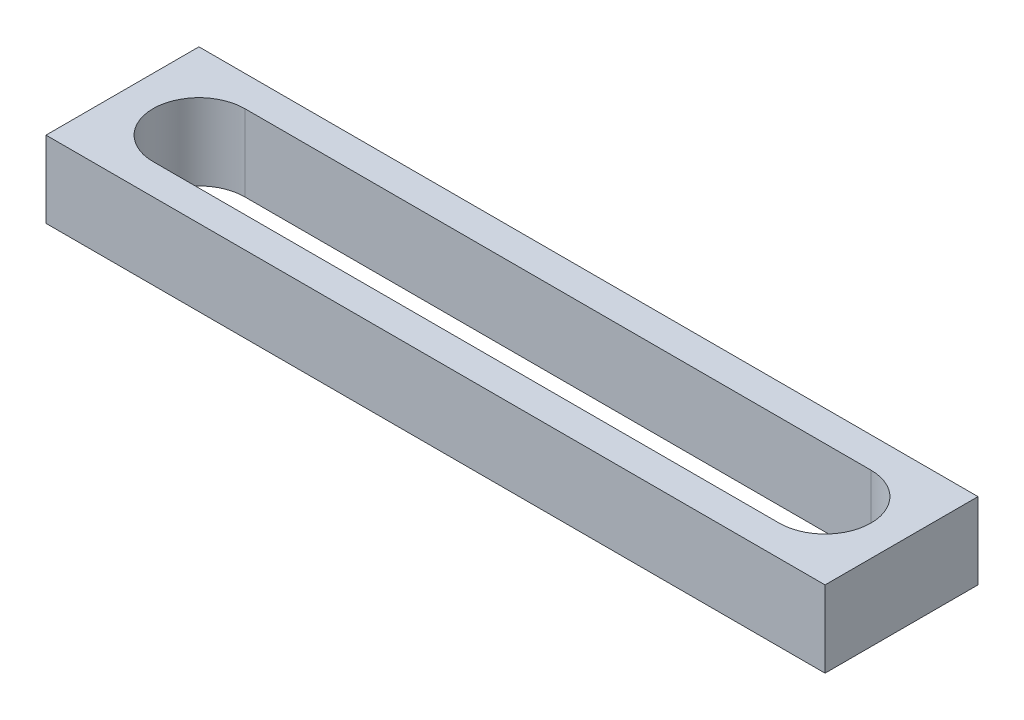
ISO-10303-21;
HEADER;
FILE_DESCRIPTION(('STEP AP214'),'2;1');
FILE_NAME('part.step','',(''),(''),'','','');
FILE_SCHEMA(('AUTOMOTIVE_DESIGN { 1 0 10303 214 1 1 1 1 }'));
ENDSEC;
DATA;
#1=APPLICATION_CONTEXT('core data for automotive mechanical design processes');
#2=APPLICATION_PROTOCOL_DEFINITION('international standard','automotive_design',2000,#1);
#3=PRODUCT_CONTEXT('',#1,'mechanical');
#4=PRODUCT('Part','Part','',(#3));
#5=PRODUCT_RELATED_PRODUCT_CATEGORY('part','',(#4));
#6=PRODUCT_DEFINITION_FORMATION('','',#4);
#7=PRODUCT_DEFINITION_CONTEXT('part definition',#1,'design');
#8=PRODUCT_DEFINITION('design','',#6,#7);
#9=PRODUCT_DEFINITION_SHAPE('','',#8);
#10=(LENGTH_UNIT() NAMED_UNIT(*) SI_UNIT(.MILLI.,.METRE.));
#11=(NAMED_UNIT(*) PLANE_ANGLE_UNIT() SI_UNIT($,.RADIAN.));
#12=(NAMED_UNIT(*) SI_UNIT($,.STERADIAN.) SOLID_ANGLE_UNIT());
#13=UNCERTAINTY_MEASURE_WITH_UNIT(LENGTH_MEASURE(1.E-05),#10,'distance_accuracy_value','');
#14=(GEOMETRIC_REPRESENTATION_CONTEXT(3) GLOBAL_UNCERTAINTY_ASSIGNED_CONTEXT((#13)) GLOBAL_UNIT_ASSIGNED_CONTEXT((#10,
#11,#12)) REPRESENTATION_CONTEXT('',''));
#15=CARTESIAN_POINT('',(0.,0.,0.));
#16=DIRECTION('',(0.,0.,1.));
#17=DIRECTION('',(1.,0.,0.));
#18=AXIS2_PLACEMENT_3D('',#15,#16,#17);
#19=CARTESIAN_POINT('',(0.,5.,0.));
#20=DIRECTION('',(0.,0.,1.));
#21=DIRECTION('',(1.,0.,0.));
#22=AXIS2_PLACEMENT_3D('',#19,#20,#21);
#23=PLANE('',#22);
#24=DIRECTION('',(-1.,0.,0.));
#25=VECTOR('',#24,1.);
#26=CARTESIAN_POINT('',(0.,0.,0.));
#27=LINE('',#26,#25);
#28=CARTESIAN_POINT('',(0.,0.,0.));
#29=VERTEX_POINT('',#28);
#30=CARTESIAN_POINT('',(-50.94,0.,0.));
#31=VERTEX_POINT('',#30);
#32=EDGE_CURVE('E148',#29,#31,#27,.T.);
#33=ORIENTED_EDGE('',*,*,#32,.F.);
#34=DIRECTION('',(0.,-1.,0.));
#35=VECTOR('',#34,1.);
#36=CARTESIAN_POINT('',(0.,5.,0.));
#37=LINE('',#36,#35);
#38=CARTESIAN_POINT('',(0.,5.,0.));
#39=VERTEX_POINT('',#38);
#40=EDGE_CURVE('E11',#39,#29,#37,.T.);
#41=ORIENTED_EDGE('',*,*,#40,.F.);
#42=DIRECTION('',(-1.,0.,0.));
#43=VECTOR('',#42,1.);
#44=CARTESIAN_POINT('',(0.,5.,0.));
#45=LINE('',#44,#43);
#46=CARTESIAN_POINT('',(-50.94,5.,0.));
#47=VERTEX_POINT('',#46);
#48=EDGE_CURVE('E154',#39,#47,#45,.T.);
#49=ORIENTED_EDGE('',*,*,#48,.T.);
#50=DIRECTION('',(0.,-1.,0.));
#51=VECTOR('',#50,1.);
#52=CARTESIAN_POINT('',(-50.94,5.,0.));
#53=LINE('',#52,#51);
#54=EDGE_CURVE('E42',#47,#31,#53,.T.);
#55=ORIENTED_EDGE('',*,*,#54,.T.);
#56=EDGE_LOOP('',(#33,#41,#49,#55));
#57=FACE_BOUND('',#56,.T.);
#58=ADVANCED_FACE('F39',(#57),#23,.T.);
#59=CARTESIAN_POINT('',(0.,5.,0.));
#60=DIRECTION('',(-1.,0.,0.));
#61=DIRECTION('',(0.,0.,1.));
#62=AXIS2_PLACEMENT_3D('',#59,#60,#61);
#63=PLANE('',#62);
#64=DIRECTION('',(0.,0.,-1.));
#65=VECTOR('',#64,1.);
#66=CARTESIAN_POINT('',(0.,0.,0.));
#67=LINE('',#66,#65);
#68=CARTESIAN_POINT('',(0.,0.,-10.));
#69=VERTEX_POINT('',#68);
#70=EDGE_CURVE('E159',#29,#69,#67,.T.);
#71=ORIENTED_EDGE('',*,*,#70,.T.);
#72=DIRECTION('',(0.,-1.,0.));
#73=VECTOR('',#72,1.);
#74=CARTESIAN_POINT('',(0.,5.,-10.));
#75=LINE('',#74,#73);
#76=CARTESIAN_POINT('',(0.,5.,-10.));
#77=VERTEX_POINT('',#76);
#78=EDGE_CURVE('E48',#77,#69,#75,.T.);
#79=ORIENTED_EDGE('',*,*,#78,.F.);
#80=DIRECTION('',(0.,0.,-1.));
#81=VECTOR('',#80,1.);
#82=CARTESIAN_POINT('',(0.,5.,0.));
#83=LINE('',#82,#81);
#84=EDGE_CURVE('E166',#39,#77,#83,.T.);
#85=ORIENTED_EDGE('',*,*,#84,.F.);
#86=ORIENTED_EDGE('',*,*,#40,.T.);
#87=EDGE_LOOP('',(#71,#79,#85,#86));
#88=FACE_BOUND('',#87,.T.);
#89=ADVANCED_FACE('F199',(#88),#63,.F.);
#90=CARTESIAN_POINT('',(0.,5.,-10.));
#91=DIRECTION('',(0.,0.,1.));
#92=DIRECTION('',(1.,0.,0.));
#93=AXIS2_PLACEMENT_3D('',#90,#91,#92);
#94=PLANE('',#93);
#95=DIRECTION('',(-1.,0.,0.));
#96=VECTOR('',#95,1.);
#97=CARTESIAN_POINT('',(0.,0.,-10.));
#98=LINE('',#97,#96);
#99=CARTESIAN_POINT('',(-50.94,0.,-9.99999999999999));
#100=VERTEX_POINT('',#99);
#101=EDGE_CURVE('E176',#69,#100,#98,.T.);
#102=ORIENTED_EDGE('',*,*,#101,.T.);
#103=DIRECTION('',(0.,-1.,0.));
#104=VECTOR('',#103,1.);
#105=CARTESIAN_POINT('',(-50.94,5.,-9.99999999999999));
#106=LINE('',#105,#104);
#107=CARTESIAN_POINT('',(-50.94,5.,-9.99999999999999));
#108=VERTEX_POINT('',#107);
#109=EDGE_CURVE('E184',#108,#100,#106,.T.);
#110=ORIENTED_EDGE('',*,*,#109,.F.);
#111=DIRECTION('',(-1.,0.,0.));
#112=VECTOR('',#111,1.);
#113=CARTESIAN_POINT('',(0.,5.,-10.));
#114=LINE('',#113,#112);
#115=EDGE_CURVE('E163',#77,#108,#114,.T.);
#116=ORIENTED_EDGE('',*,*,#115,.F.);
#117=ORIENTED_EDGE('',*,*,#78,.T.);
#118=EDGE_LOOP('',(#102,#110,#116,#117));
#119=FACE_BOUND('',#118,.T.);
#120=ADVANCED_FACE('F203',(#119),#94,.F.);
#121=CARTESIAN_POINT('',(-50.94,5.,0.));
#122=DIRECTION('',(-1.,0.,0.));
#123=DIRECTION('',(0.,0.,1.));
#124=AXIS2_PLACEMENT_3D('',#121,#122,#123);
#125=PLANE('',#124);
#126=DIRECTION('',(0.,0.,-1.));
#127=VECTOR('',#126,1.);
#128=CARTESIAN_POINT('',(-50.94,0.,0.));
#129=LINE('',#128,#127);
#130=EDGE_CURVE('E172',#31,#100,#129,.T.);
#131=ORIENTED_EDGE('',*,*,#130,.F.);
#132=ORIENTED_EDGE('',*,*,#54,.F.);
#133=DIRECTION('',(0.,0.,-1.));
#134=VECTOR('',#133,1.);
#135=CARTESIAN_POINT('',(-50.94,5.,0.));
#136=LINE('',#135,#134);
#137=EDGE_CURVE('E158',#47,#108,#136,.T.);
#138=ORIENTED_EDGE('',*,*,#137,.T.);
#139=ORIENTED_EDGE('',*,*,#109,.T.);
#140=EDGE_LOOP('',(#131,#132,#138,#139));
#141=FACE_BOUND('',#140,.T.);
#142=ADVANCED_FACE('F194',(#141),#125,.T.);
#143=CARTESIAN_POINT('',(0.,5.,0.));
#144=DIRECTION('',(0.,-1.,0.));
#145=DIRECTION('',(0.,0.,-1.));
#146=AXIS2_PLACEMENT_3D('',#143,#144,#145);
#147=PLANE('',#146);
#148=DIRECTION('',(1.,0.,0.));
#149=VECTOR('',#148,1.);
#150=CARTESIAN_POINT('',(-45.94,5.,-1.99999999999999));
#151=LINE('',#150,#149);
#152=CARTESIAN_POINT('',(-45.94,5.,-1.99999999999999));
#153=VERTEX_POINT('',#152);
#154=CARTESIAN_POINT('',(-4.99999999999998,5.,-1.99999999999999));
#155=VERTEX_POINT('',#154);
#156=EDGE_CURVE('E139',#153,#155,#151,.T.);
#157=ORIENTED_EDGE('',*,*,#156,.F.);
#158=CARTESIAN_POINT('',(-45.94,5.,-4.99999999999999));
#159=DIRECTION('',(0.,1.,0.));
#160=DIRECTION('',(0.,0.,1.));
#161=AXIS2_PLACEMENT_3D('',#158,#159,#160);
#162=CIRCLE('',#161,3.);
#163=CARTESIAN_POINT('',(-45.94,5.,-7.99999999999999));
#164=VERTEX_POINT('',#163);
#165=EDGE_CURVE('E56',#164,#153,#162,.T.);
#166=ORIENTED_EDGE('',*,*,#165,.F.);
#167=DIRECTION('',(-1.,0.,0.));
#168=VECTOR('',#167,1.);
#169=CARTESIAN_POINT('',(-45.94,5.,-7.99999999999999));
#170=LINE('',#169,#168);
#171=CARTESIAN_POINT('',(-4.99999999999998,5.,-7.99999999999999));
#172=VERTEX_POINT('',#171);
#173=EDGE_CURVE('E126',#172,#164,#170,.T.);
#174=ORIENTED_EDGE('',*,*,#173,.F.);
#175=CARTESIAN_POINT('',(-4.99999999999998,5.,-4.99999999999999));
#176=DIRECTION('',(0.,1.,0.));
#177=DIRECTION('',(0.,0.,-1.));
#178=AXIS2_PLACEMENT_3D('',#175,#176,#177);
#179=CIRCLE('',#178,3.);
#180=EDGE_CURVE('E130',#155,#172,#179,.T.);
#181=ORIENTED_EDGE('',*,*,#180,.F.);
#182=EDGE_LOOP('',(#157,#166,#174,#181));
#183=FACE_BOUND('',#182,.T.);
#184=ORIENTED_EDGE('',*,*,#48,.F.);
#185=ORIENTED_EDGE('',*,*,#84,.T.);
#186=ORIENTED_EDGE('',*,*,#115,.T.);
#187=ORIENTED_EDGE('',*,*,#137,.F.);
#188=EDGE_LOOP('',(#184,#185,#186,#187));
#189=FACE_BOUND('',#188,.T.);
#190=ADVANCED_FACE('F205',(#183,#189),#147,.F.);
#191=CARTESIAN_POINT('',(0.,0.,0.));
#192=DIRECTION('',(0.,-1.,0.));
#193=DIRECTION('',(0.,0.,-1.));
#194=AXIS2_PLACEMENT_3D('',#191,#192,#193);
#195=PLANE('',#194);
#196=CARTESIAN_POINT('',(-45.94,0.,-4.99999999999999));
#197=DIRECTION('',(0.,1.,0.));
#198=DIRECTION('',(0.,0.,1.));
#199=AXIS2_PLACEMENT_3D('',#196,#197,#198);
#200=CIRCLE('',#199,3.);
#201=CARTESIAN_POINT('',(-45.94,0.,-7.99999999999999));
#202=VERTEX_POINT('',#201);
#203=CARTESIAN_POINT('',(-45.94,0.,-1.99999999999999));
#204=VERTEX_POINT('',#203);
#205=EDGE_CURVE('E107',#202,#204,#200,.T.);
#206=ORIENTED_EDGE('',*,*,#205,.T.);
#207=DIRECTION('',(1.,0.,0.));
#208=VECTOR('',#207,1.);
#209=CARTESIAN_POINT('',(-45.94,0.,-1.99999999999999));
#210=LINE('',#209,#208);
#211=CARTESIAN_POINT('',(-4.99999999999998,0.,-1.99999999999999));
#212=VERTEX_POINT('',#211);
#213=EDGE_CURVE('E117',#204,#212,#210,.T.);
#214=ORIENTED_EDGE('',*,*,#213,.T.);
#215=CARTESIAN_POINT('',(-4.99999999999998,0.,-4.99999999999999));
#216=DIRECTION('',(0.,1.,0.));
#217=DIRECTION('',(0.,0.,-1.));
#218=AXIS2_PLACEMENT_3D('',#215,#216,#217);
#219=CIRCLE('',#218,3.);
#220=CARTESIAN_POINT('',(-4.99999999999998,0.,-7.99999999999999));
#221=VERTEX_POINT('',#220);
#222=EDGE_CURVE('E64',#212,#221,#219,.T.);
#223=ORIENTED_EDGE('',*,*,#222,.T.);
#224=DIRECTION('',(-1.,0.,0.));
#225=VECTOR('',#224,1.);
#226=CARTESIAN_POINT('',(-45.94,0.,-7.99999999999999));
#227=LINE('',#226,#225);
#228=EDGE_CURVE('E114',#221,#202,#227,.T.);
#229=ORIENTED_EDGE('',*,*,#228,.T.);
#230=EDGE_LOOP('',(#206,#214,#223,#229));
#231=FACE_BOUND('',#230,.T.);
#232=ORIENTED_EDGE('',*,*,#32,.T.);
#233=ORIENTED_EDGE('',*,*,#130,.T.);
#234=ORIENTED_EDGE('',*,*,#101,.F.);
#235=ORIENTED_EDGE('',*,*,#70,.F.);
#236=EDGE_LOOP('',(#232,#233,#234,#235));
#237=FACE_BOUND('',#236,.T.);
#238=ADVANCED_FACE('F122',(#231,#237),#195,.T.);
#239=CARTESIAN_POINT('',(-45.94,0.,-4.99999999999999));
#240=DIRECTION('',(0.,1.,0.));
#241=DIRECTION('',(0.,0.,1.));
#242=AXIS2_PLACEMENT_3D('',#239,#240,#241);
#243=CYLINDRICAL_SURFACE('',#242,3.);
#244=ORIENTED_EDGE('',*,*,#165,.T.);
#245=DIRECTION('',(0.,1.,0.));
#246=VECTOR('',#245,1.);
#247=CARTESIAN_POINT('',(-45.94,0.,-1.99999999999999));
#248=LINE('',#247,#246);
#249=EDGE_CURVE('E103',#204,#153,#248,.T.);
#250=ORIENTED_EDGE('',*,*,#249,.F.);
#251=ORIENTED_EDGE('',*,*,#205,.F.);
#252=DIRECTION('',(0.,1.,0.));
#253=VECTOR('',#252,1.);
#254=CARTESIAN_POINT('',(-45.94,0.,-7.99999999999999));
#255=LINE('',#254,#253);
#256=EDGE_CURVE('E145',#202,#164,#255,.T.);
#257=ORIENTED_EDGE('',*,*,#256,.T.);
#258=EDGE_LOOP('',(#244,#250,#251,#257));
#259=FACE_BOUND('',#258,.T.);
#260=ADVANCED_FACE('F105',(#259),#243,.F.);
#261=CARTESIAN_POINT('',(-45.94,0.,-7.99999999999999));
#262=DIRECTION('',(0.,0.,-1.));
#263=DIRECTION('',(-1.,0.,0.));
#264=AXIS2_PLACEMENT_3D('',#261,#262,#263);
#265=PLANE('',#264);
#266=ORIENTED_EDGE('',*,*,#173,.T.);
#267=ORIENTED_EDGE('',*,*,#256,.F.);
#268=ORIENTED_EDGE('',*,*,#228,.F.);
#269=DIRECTION('',(0.,1.,0.));
#270=VECTOR('',#269,1.);
#271=CARTESIAN_POINT('',(-4.99999999999998,0.,-7.99999999999999));
#272=LINE('',#271,#270);
#273=EDGE_CURVE('E149',#221,#172,#272,.T.);
#274=ORIENTED_EDGE('',*,*,#273,.T.);
#275=EDGE_LOOP('',(#266,#267,#268,#274));
#276=FACE_BOUND('',#275,.T.);
#277=ADVANCED_FACE('F249',(#276),#265,.F.);
#278=CARTESIAN_POINT('',(-4.99999999999998,0.,-4.99999999999999));
#279=DIRECTION('',(0.,1.,0.));
#280=DIRECTION('',(0.,0.,1.));
#281=AXIS2_PLACEMENT_3D('',#278,#279,#280);
#282=CYLINDRICAL_SURFACE('',#281,3.);
#283=ORIENTED_EDGE('',*,*,#180,.T.);
#284=ORIENTED_EDGE('',*,*,#273,.F.);
#285=ORIENTED_EDGE('',*,*,#222,.F.);
#286=DIRECTION('',(0.,1.,0.));
#287=VECTOR('',#286,1.);
#288=CARTESIAN_POINT('',(-4.99999999999998,0.,-1.99999999999999));
#289=LINE('',#288,#287);
#290=EDGE_CURVE('E113',#212,#155,#289,.T.);
#291=ORIENTED_EDGE('',*,*,#290,.T.);
#292=EDGE_LOOP('',(#283,#284,#285,#291));
#293=FACE_BOUND('',#292,.T.);
#294=ADVANCED_FACE('F257',(#293),#282,.F.);
#295=CARTESIAN_POINT('',(-45.94,0.,-1.99999999999999));
#296=DIRECTION('',(0.,0.,1.));
#297=DIRECTION('',(1.,0.,0.));
#298=AXIS2_PLACEMENT_3D('',#295,#296,#297);
#299=PLANE('',#298);
#300=ORIENTED_EDGE('',*,*,#156,.T.);
#301=ORIENTED_EDGE('',*,*,#290,.F.);
#302=ORIENTED_EDGE('',*,*,#213,.F.);
#303=ORIENTED_EDGE('',*,*,#249,.T.);
#304=EDGE_LOOP('',(#300,#301,#302,#303));
#305=FACE_BOUND('',#304,.T.);
#306=ADVANCED_FACE('F118',(#305),#299,.F.);
#307=CLOSED_SHELL('',(#58,#89,#120,#142,#190,#238,#260,#277,#294,#306));
#308=MANIFOLD_SOLID_BREP('B2',#307);
#309=ADVANCED_BREP_SHAPE_REPRESENTATION('',(#18,#308),#14);
#310=SHAPE_DEFINITION_REPRESENTATION(#9,#309);
ENDSEC;
END-ISO-10303-21;
